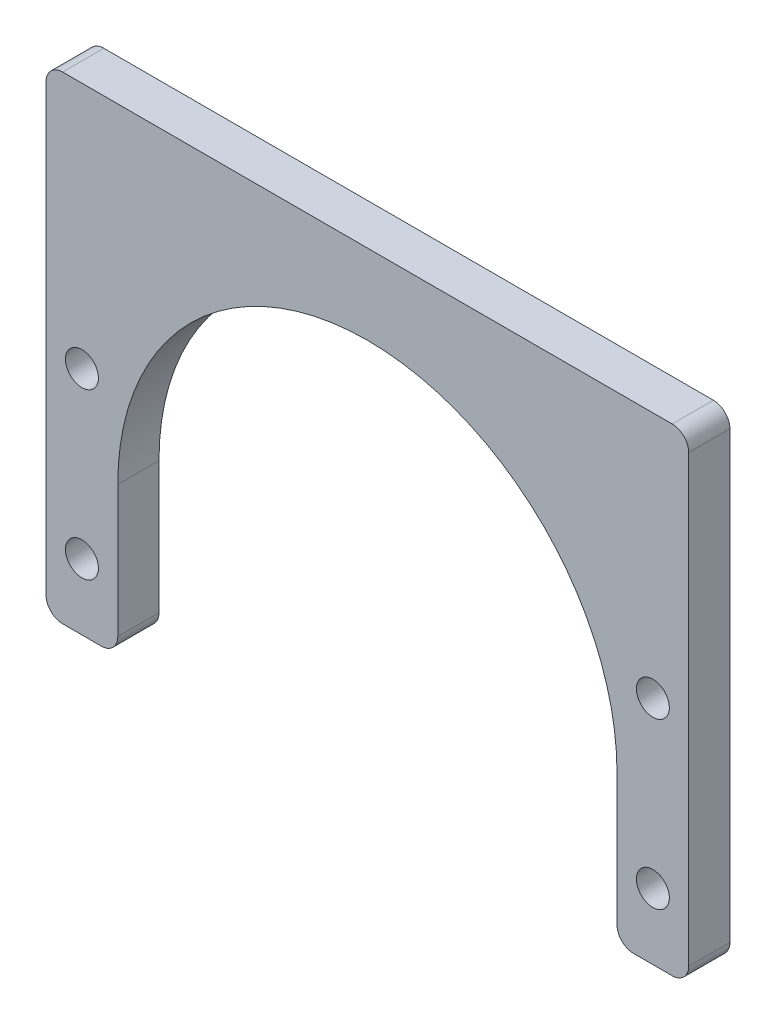
ISO-10303-21;
HEADER;
FILE_DESCRIPTION(('STEP AP214'),'2;1');
FILE_NAME('part.step','',(''),(''),'','','');
FILE_SCHEMA(('AUTOMOTIVE_DESIGN { 1 0 10303 214 1 1 1 1 }'));
ENDSEC;
DATA;
#1=APPLICATION_CONTEXT('core data for automotive mechanical design processes');
#2=APPLICATION_PROTOCOL_DEFINITION('international standard','automotive_design',2000,#1);
#3=PRODUCT_CONTEXT('',#1,'mechanical');
#4=PRODUCT('Part','Part','',(#3));
#5=PRODUCT_RELATED_PRODUCT_CATEGORY('part','',(#4));
#6=PRODUCT_DEFINITION_FORMATION('','',#4);
#7=PRODUCT_DEFINITION_CONTEXT('part definition',#1,'design');
#8=PRODUCT_DEFINITION('design','',#6,#7);
#9=PRODUCT_DEFINITION_SHAPE('','',#8);
#10=(LENGTH_UNIT() NAMED_UNIT(*) SI_UNIT(.MILLI.,.METRE.));
#11=(NAMED_UNIT(*) PLANE_ANGLE_UNIT() SI_UNIT($,.RADIAN.));
#12=(NAMED_UNIT(*) SI_UNIT($,.STERADIAN.) SOLID_ANGLE_UNIT());
#13=UNCERTAINTY_MEASURE_WITH_UNIT(LENGTH_MEASURE(1.E-05),#10,'distance_accuracy_value','');
#14=(GEOMETRIC_REPRESENTATION_CONTEXT(3) GLOBAL_UNCERTAINTY_ASSIGNED_CONTEXT((#13)) GLOBAL_UNIT_ASSIGNED_CONTEXT((#10,
#11,#12)) REPRESENTATION_CONTEXT('',''));
#15=CARTESIAN_POINT('',(0.,0.,0.));
#16=DIRECTION('',(0.,0.,1.));
#17=DIRECTION('',(1.,0.,0.));
#18=AXIS2_PLACEMENT_3D('',#15,#16,#17);
#19=CARTESIAN_POINT('',(0.,0.,5.));
#20=DIRECTION('',(0.,0.,-1.));
#21=DIRECTION('',(-1.,0.,0.));
#22=AXIS2_PLACEMENT_3D('',#19,#20,#21);
#23=CYLINDRICAL_SURFACE('',#22,30.3);
#24=CARTESIAN_POINT('',(0.,0.,0.));
#25=DIRECTION('',(0.,0.,1.));
#26=DIRECTION('',(1.,0.,0.));
#27=AXIS2_PLACEMENT_3D('',#24,#25,#26);
#28=CIRCLE('',#27,30.3);
#29=CARTESIAN_POINT('',(30.3,0.,0.));
#30=VERTEX_POINT('',#29);
#31=CARTESIAN_POINT('',(-30.3,0.,0.));
#32=VERTEX_POINT('',#31);
#33=EDGE_CURVE('E145',#30,#32,#28,.T.);
#34=ORIENTED_EDGE('',*,*,#33,.F.);
#35=DIRECTION('',(0.,0.,-1.));
#36=VECTOR('',#35,1.);
#37=CARTESIAN_POINT('',(30.3,0.,5.));
#38=LINE('',#37,#36);
#39=CARTESIAN_POINT('',(30.3,0.,5.));
#40=VERTEX_POINT('',#39);
#41=EDGE_CURVE('E139',#40,#30,#38,.T.);
#42=ORIENTED_EDGE('',*,*,#41,.F.);
#43=CARTESIAN_POINT('',(0.,0.,5.));
#44=DIRECTION('',(0.,0.,1.));
#45=DIRECTION('',(1.,0.,0.));
#46=AXIS2_PLACEMENT_3D('',#43,#44,#45);
#47=CIRCLE('',#46,30.3);
#48=CARTESIAN_POINT('',(-30.3,0.,5.));
#49=VERTEX_POINT('',#48);
#50=EDGE_CURVE('E142',#40,#49,#47,.T.);
#51=ORIENTED_EDGE('',*,*,#50,.T.);
#52=DIRECTION('',(0.,0.,-1.));
#53=VECTOR('',#52,1.);
#54=CARTESIAN_POINT('',(-30.3,0.,5.));
#55=LINE('',#54,#53);
#56=EDGE_CURVE('E150',#49,#32,#55,.T.);
#57=ORIENTED_EDGE('',*,*,#56,.T.);
#58=EDGE_LOOP('',(#34,#42,#51,#57));
#59=FACE_BOUND('',#58,.T.);
#60=ADVANCED_FACE('F36',(#59),#23,.F.);
#61=CARTESIAN_POINT('',(30.3,0.,5.));
#62=DIRECTION('',(1.,0.,0.));
#63=DIRECTION('',(0.,1.,0.));
#64=AXIS2_PLACEMENT_3D('',#61,#62,#63);
#65=PLANE('',#64);
#66=DIRECTION('',(0.,-1.,0.));
#67=VECTOR('',#66,1.);
#68=CARTESIAN_POINT('',(30.3,0.,0.));
#69=LINE('',#68,#67);
#70=CARTESIAN_POINT('',(30.3,-16.,0.));
#71=VERTEX_POINT('',#70);
#72=EDGE_CURVE('E198',#30,#71,#69,.T.);
#73=ORIENTED_EDGE('',*,*,#72,.T.);
#74=DIRECTION('',(0.,0.,-1.));
#75=VECTOR('',#74,1.);
#76=CARTESIAN_POINT('',(30.3,-16.,5.));
#77=LINE('',#76,#75);
#78=CARTESIAN_POINT('',(30.3,-16.,5.));
#79=VERTEX_POINT('',#78);
#80=EDGE_CURVE('E156',#71,#79,#77,.F.);
#81=ORIENTED_EDGE('',*,*,#80,.T.);
#82=DIRECTION('',(0.,-1.,0.));
#83=VECTOR('',#82,1.);
#84=CARTESIAN_POINT('',(30.3,0.,5.));
#85=LINE('',#84,#83);
#86=EDGE_CURVE('E153',#40,#79,#85,.T.);
#87=ORIENTED_EDGE('',*,*,#86,.F.);
#88=ORIENTED_EDGE('',*,*,#41,.T.);
#89=EDGE_LOOP('',(#73,#81,#87,#88));
#90=FACE_BOUND('',#89,.T.);
#91=ADVANCED_FACE('F154',(#90),#65,.F.);
#92=CARTESIAN_POINT('',(0.,-18.,5.));
#93=DIRECTION('',(0.,1.,0.));
#94=DIRECTION('',(-1.,0.,0.));
#95=AXIS2_PLACEMENT_3D('',#92,#93,#94);
#96=PLANE('',#95);
#97=DIRECTION('',(1.,0.,0.));
#98=VECTOR('',#97,1.);
#99=CARTESIAN_POINT('',(0.,-18.,5.));
#100=LINE('',#99,#98);
#101=CARTESIAN_POINT('',(32.3,-18.,5.));
#102=VERTEX_POINT('',#101);
#103=CARTESIAN_POINT('',(37.,-18.,5.));
#104=VERTEX_POINT('',#103);
#105=EDGE_CURVE('E158',#102,#104,#100,.T.);
#106=ORIENTED_EDGE('',*,*,#105,.F.);
#107=DIRECTION('',(0.,0.,-1.));
#108=VECTOR('',#107,1.);
#109=CARTESIAN_POINT('',(32.3,-18.,5.));
#110=LINE('',#109,#108);
#111=CARTESIAN_POINT('',(32.3,-18.,0.));
#112=VERTEX_POINT('',#111);
#113=EDGE_CURVE('E262',#102,#112,#110,.T.);
#114=ORIENTED_EDGE('',*,*,#113,.T.);
#115=DIRECTION('',(1.,0.,0.));
#116=VECTOR('',#115,1.);
#117=CARTESIAN_POINT('',(0.,-18.,0.));
#118=LINE('',#117,#116);
#119=CARTESIAN_POINT('',(37.,-18.,0.));
#120=VERTEX_POINT('',#119);
#121=EDGE_CURVE('E200',#112,#120,#118,.T.);
#122=ORIENTED_EDGE('',*,*,#121,.T.);
#123=DIRECTION('',(0.,0.,-1.));
#124=VECTOR('',#123,1.);
#125=CARTESIAN_POINT('',(37.,-18.,5.));
#126=LINE('',#125,#124);
#127=EDGE_CURVE('E260',#120,#104,#126,.F.);
#128=ORIENTED_EDGE('',*,*,#127,.T.);
#129=EDGE_LOOP('',(#106,#114,#122,#128));
#130=FACE_BOUND('',#129,.T.);
#131=ADVANCED_FACE('F306',(#130),#96,.F.);
#132=CARTESIAN_POINT('',(39.,0.,5.));
#133=DIRECTION('',(1.,0.,0.));
#134=DIRECTION('',(0.,1.,0.));
#135=AXIS2_PLACEMENT_3D('',#132,#133,#134);
#136=PLANE('',#135);
#137=DIRECTION('',(0.,-1.,0.));
#138=VECTOR('',#137,1.);
#139=CARTESIAN_POINT('',(39.,0.,5.));
#140=LINE('',#139,#138);
#141=CARTESIAN_POINT('',(39.,38.,5.));
#142=VERTEX_POINT('',#141);
#143=CARTESIAN_POINT('',(39.,-16.,5.));
#144=VERTEX_POINT('',#143);
#145=EDGE_CURVE('E173',#142,#144,#140,.T.);
#146=ORIENTED_EDGE('',*,*,#145,.T.);
#147=DIRECTION('',(0.,0.,-1.));
#148=VECTOR('',#147,1.);
#149=CARTESIAN_POINT('',(39.,-16.,0.));
#150=LINE('',#149,#148);
#151=CARTESIAN_POINT('',(39.,-16.,0.));
#152=VERTEX_POINT('',#151);
#153=EDGE_CURVE('E268',#144,#152,#150,.T.);
#154=ORIENTED_EDGE('',*,*,#153,.T.);
#155=DIRECTION('',(0.,-1.,0.));
#156=VECTOR('',#155,1.);
#157=CARTESIAN_POINT('',(39.,0.,0.));
#158=LINE('',#157,#156);
#159=CARTESIAN_POINT('',(39.,38.,0.));
#160=VERTEX_POINT('',#159);
#161=EDGE_CURVE('E203',#160,#152,#158,.T.);
#162=ORIENTED_EDGE('',*,*,#161,.F.);
#163=DIRECTION('',(0.,0.,-1.));
#164=VECTOR('',#163,1.);
#165=CARTESIAN_POINT('',(39.,38.,5.));
#166=LINE('',#165,#164);
#167=EDGE_CURVE('E266',#160,#142,#166,.F.);
#168=ORIENTED_EDGE('',*,*,#167,.T.);
#169=EDGE_LOOP('',(#146,#154,#162,#168));
#170=FACE_BOUND('',#169,.T.);
#171=ADVANCED_FACE('F312',(#170),#136,.T.);
#172=CARTESIAN_POINT('',(0.,40.,5.));
#173=DIRECTION('',(0.,1.,0.));
#174=DIRECTION('',(-1.,0.,0.));
#175=AXIS2_PLACEMENT_3D('',#172,#173,#174);
#176=PLANE('',#175);
#177=DIRECTION('',(1.,0.,0.));
#178=VECTOR('',#177,1.);
#179=CARTESIAN_POINT('',(0.,40.,5.));
#180=LINE('',#179,#178);
#181=CARTESIAN_POINT('',(-37.,40.,5.));
#182=VERTEX_POINT('',#181);
#183=CARTESIAN_POINT('',(37.,40.,5.));
#184=VERTEX_POINT('',#183);
#185=EDGE_CURVE('E176',#182,#184,#180,.T.);
#186=ORIENTED_EDGE('',*,*,#185,.T.);
#187=DIRECTION('',(0.,0.,-1.));
#188=VECTOR('',#187,1.);
#189=CARTESIAN_POINT('',(37.,40.,5.));
#190=LINE('',#189,#188);
#191=CARTESIAN_POINT('',(37.,40.,0.));
#192=VERTEX_POINT('',#191);
#193=EDGE_CURVE('E11',#184,#192,#190,.T.);
#194=ORIENTED_EDGE('',*,*,#193,.T.);
#195=DIRECTION('',(1.,0.,0.));
#196=VECTOR('',#195,1.);
#197=CARTESIAN_POINT('',(0.,40.,0.));
#198=LINE('',#197,#196);
#199=CARTESIAN_POINT('',(-37.,40.,0.));
#200=VERTEX_POINT('',#199);
#201=EDGE_CURVE('E206',#200,#192,#198,.T.);
#202=ORIENTED_EDGE('',*,*,#201,.F.);
#203=DIRECTION('',(0.,0.,-1.));
#204=VECTOR('',#203,1.);
#205=CARTESIAN_POINT('',(-37.,40.,5.));
#206=LINE('',#205,#204);
#207=EDGE_CURVE('E44',#200,#182,#206,.F.);
#208=ORIENTED_EDGE('',*,*,#207,.T.);
#209=EDGE_LOOP('',(#186,#194,#202,#208));
#210=FACE_BOUND('',#209,.T.);
#211=ADVANCED_FACE('F273',(#210),#176,.T.);
#212=CARTESIAN_POINT('',(-39.,0.,5.));
#213=DIRECTION('',(1.,0.,0.));
#214=DIRECTION('',(0.,1.,0.));
#215=AXIS2_PLACEMENT_3D('',#212,#213,#214);
#216=PLANE('',#215);
#217=DIRECTION('',(0.,-1.,0.));
#218=VECTOR('',#217,1.);
#219=CARTESIAN_POINT('',(-39.,0.,0.));
#220=LINE('',#219,#218);
#221=CARTESIAN_POINT('',(-39.,38.,0.));
#222=VERTEX_POINT('',#221);
#223=CARTESIAN_POINT('',(-39.,-16.,0.));
#224=VERTEX_POINT('',#223);
#225=EDGE_CURVE('E209',#222,#224,#220,.T.);
#226=ORIENTED_EDGE('',*,*,#225,.T.);
#227=DIRECTION('',(0.,0.,-1.));
#228=VECTOR('',#227,1.);
#229=CARTESIAN_POINT('',(-39.,-16.,5.));
#230=LINE('',#229,#228);
#231=CARTESIAN_POINT('',(-39.,-16.,5.));
#232=VERTEX_POINT('',#231);
#233=EDGE_CURVE('E51',#224,#232,#230,.F.);
#234=ORIENTED_EDGE('',*,*,#233,.T.);
#235=DIRECTION('',(0.,-1.,0.));
#236=VECTOR('',#235,1.);
#237=CARTESIAN_POINT('',(-39.,0.,5.));
#238=LINE('',#237,#236);
#239=CARTESIAN_POINT('',(-39.,38.,5.));
#240=VERTEX_POINT('',#239);
#241=EDGE_CURVE('E179',#240,#232,#238,.T.);
#242=ORIENTED_EDGE('',*,*,#241,.F.);
#243=DIRECTION('',(0.,0.,-1.));
#244=VECTOR('',#243,1.);
#245=CARTESIAN_POINT('',(-39.,38.,0.));
#246=LINE('',#245,#244);
#247=EDGE_CURVE('E256',#240,#222,#246,.T.);
#248=ORIENTED_EDGE('',*,*,#247,.T.);
#249=EDGE_LOOP('',(#226,#234,#242,#248));
#250=FACE_BOUND('',#249,.T.);
#251=ADVANCED_FACE('F280',(#250),#216,.F.);
#252=CARTESIAN_POINT('',(0.,-18.,5.));
#253=DIRECTION('',(0.,-1.,0.));
#254=DIRECTION('',(0.,0.,-1.));
#255=AXIS2_PLACEMENT_3D('',#252,#253,#254);
#256=PLANE('',#255);
#257=DIRECTION('',(-1.,0.,0.));
#258=VECTOR('',#257,1.);
#259=CARTESIAN_POINT('',(0.,-18.,0.));
#260=LINE('',#259,#258);
#261=CARTESIAN_POINT('',(-32.3,-18.,0.));
#262=VERTEX_POINT('',#261);
#263=CARTESIAN_POINT('',(-37.,-18.,0.));
#264=VERTEX_POINT('',#263);
#265=EDGE_CURVE('E211',#262,#264,#260,.T.);
#266=ORIENTED_EDGE('',*,*,#265,.F.);
#267=DIRECTION('',(0.,0.,-1.));
#268=VECTOR('',#267,1.);
#269=CARTESIAN_POINT('',(-32.3,-18.,5.));
#270=LINE('',#269,#268);
#271=CARTESIAN_POINT('',(-32.3,-18.,5.));
#272=VERTEX_POINT('',#271);
#273=EDGE_CURVE('E243',#262,#272,#270,.F.);
#274=ORIENTED_EDGE('',*,*,#273,.T.);
#275=DIRECTION('',(-1.,0.,0.));
#276=VECTOR('',#275,1.);
#277=CARTESIAN_POINT('',(0.,-18.,5.));
#278=LINE('',#277,#276);
#279=CARTESIAN_POINT('',(-37.,-18.,5.));
#280=VERTEX_POINT('',#279);
#281=EDGE_CURVE('E181',#272,#280,#278,.T.);
#282=ORIENTED_EDGE('',*,*,#281,.T.);
#283=DIRECTION('',(0.,0.,-1.));
#284=VECTOR('',#283,1.);
#285=CARTESIAN_POINT('',(-37.,-18.,0.));
#286=LINE('',#285,#284);
#287=EDGE_CURVE('E240',#280,#264,#286,.T.);
#288=ORIENTED_EDGE('',*,*,#287,.T.);
#289=EDGE_LOOP('',(#266,#274,#282,#288));
#290=FACE_BOUND('',#289,.T.);
#291=ADVANCED_FACE('F290',(#290),#256,.T.);
#292=CARTESIAN_POINT('',(-34.65,-10.,5.));
#293=DIRECTION('',(0.,0.,-1.));
#294=DIRECTION('',(-1.,0.,0.));
#295=AXIS2_PLACEMENT_3D('',#292,#293,#294);
#296=CYLINDRICAL_SURFACE('',#295,2.);
#297=CARTESIAN_POINT('',(-34.65,-10.,5.));
#298=DIRECTION('',(0.,0.,1.));
#299=DIRECTION('',(1.,0.,0.));
#300=AXIS2_PLACEMENT_3D('',#297,#298,#299);
#301=CIRCLE('',#300,2.);
#302=CARTESIAN_POINT('',(-32.65,-10.,5.));
#303=VERTEX_POINT('',#302);
#304=EDGE_CURVE('E191',#303,#303,#301,.F.);
#305=ORIENTED_EDGE('',*,*,#304,.F.);
#306=EDGE_LOOP('',(#305));
#307=FACE_BOUND('',#306,.T.);
#308=CARTESIAN_POINT('',(-34.65,-10.,0.));
#309=DIRECTION('',(0.,0.,1.));
#310=DIRECTION('',(1.,0.,0.));
#311=AXIS2_PLACEMENT_3D('',#308,#309,#310);
#312=CIRCLE('',#311,2.);
#313=CARTESIAN_POINT('',(-32.65,-10.,0.));
#314=VERTEX_POINT('',#313);
#315=EDGE_CURVE('E168',#314,#314,#312,.F.);
#316=ORIENTED_EDGE('',*,*,#315,.T.);
#317=EDGE_LOOP('',(#316));
#318=FACE_BOUND('',#317,.T.);
#319=ADVANCED_FACE('F409',(#307,#318),#296,.F.);
#320=CARTESIAN_POINT('',(34.65,10.,5.));
#321=DIRECTION('',(0.,0.,-1.));
#322=DIRECTION('',(-1.,0.,0.));
#323=AXIS2_PLACEMENT_3D('',#320,#321,#322);
#324=CYLINDRICAL_SURFACE('',#323,2.);
#325=CARTESIAN_POINT('',(34.65,10.,5.));
#326=DIRECTION('',(0.,0.,1.));
#327=DIRECTION('',(1.,0.,0.));
#328=AXIS2_PLACEMENT_3D('',#325,#326,#327);
#329=CIRCLE('',#328,2.);
#330=CARTESIAN_POINT('',(36.65,10.,5.));
#331=VERTEX_POINT('',#330);
#332=EDGE_CURVE('E188',#331,#331,#329,.F.);
#333=ORIENTED_EDGE('',*,*,#332,.F.);
#334=EDGE_LOOP('',(#333));
#335=FACE_BOUND('',#334,.T.);
#336=CARTESIAN_POINT('',(34.65,10.,0.));
#337=DIRECTION('',(0.,0.,1.));
#338=DIRECTION('',(1.,0.,0.));
#339=AXIS2_PLACEMENT_3D('',#336,#337,#338);
#340=CIRCLE('',#339,2.);
#341=CARTESIAN_POINT('',(36.65,10.,0.));
#342=VERTEX_POINT('',#341);
#343=EDGE_CURVE('E220',#342,#342,#340,.F.);
#344=ORIENTED_EDGE('',*,*,#343,.T.);
#345=EDGE_LOOP('',(#344));
#346=FACE_BOUND('',#345,.T.);
#347=ADVANCED_FACE('F464',(#335,#346),#324,.F.);
#348=CARTESIAN_POINT('',(-34.65,10.,5.));
#349=DIRECTION('',(0.,0.,-1.));
#350=DIRECTION('',(-1.,0.,0.));
#351=AXIS2_PLACEMENT_3D('',#348,#349,#350);
#352=CYLINDRICAL_SURFACE('',#351,2.);
#353=CARTESIAN_POINT('',(-34.65,10.,5.));
#354=DIRECTION('',(0.,0.,1.));
#355=DIRECTION('',(1.,0.,0.));
#356=AXIS2_PLACEMENT_3D('',#353,#354,#355);
#357=CIRCLE('',#356,2.);
#358=CARTESIAN_POINT('',(-32.65,10.,5.));
#359=VERTEX_POINT('',#358);
#360=EDGE_CURVE('E185',#359,#359,#357,.T.);
#361=ORIENTED_EDGE('',*,*,#360,.T.);
#362=EDGE_LOOP('',(#361));
#363=FACE_BOUND('',#362,.T.);
#364=CARTESIAN_POINT('',(-34.65,10.,0.));
#365=DIRECTION('',(0.,0.,1.));
#366=DIRECTION('',(1.,0.,0.));
#367=AXIS2_PLACEMENT_3D('',#364,#365,#366);
#368=CIRCLE('',#367,2.);
#369=CARTESIAN_POINT('',(-32.65,10.,0.));
#370=VERTEX_POINT('',#369);
#371=EDGE_CURVE('E217',#370,#370,#368,.T.);
#372=ORIENTED_EDGE('',*,*,#371,.F.);
#373=EDGE_LOOP('',(#372));
#374=FACE_BOUND('',#373,.T.);
#375=ADVANCED_FACE('F397',(#363,#374),#352,.F.);
#376=CARTESIAN_POINT('',(-30.3,0.,5.));
#377=DIRECTION('',(1.,0.,0.));
#378=DIRECTION('',(0.,1.,0.));
#379=AXIS2_PLACEMENT_3D('',#376,#377,#378);
#380=PLANE('',#379);
#381=DIRECTION('',(0.,-1.,0.));
#382=VECTOR('',#381,1.);
#383=CARTESIAN_POINT('',(-30.3,0.,5.));
#384=LINE('',#383,#382);
#385=CARTESIAN_POINT('',(-30.3,-16.,5.));
#386=VERTEX_POINT('',#385);
#387=EDGE_CURVE('E164',#49,#386,#384,.T.);
#388=ORIENTED_EDGE('',*,*,#387,.T.);
#389=DIRECTION('',(0.,0.,-1.));
#390=VECTOR('',#389,1.);
#391=CARTESIAN_POINT('',(-30.3,-16.,5.));
#392=LINE('',#391,#390);
#393=CARTESIAN_POINT('',(-30.3,-16.,0.));
#394=VERTEX_POINT('',#393);
#395=EDGE_CURVE('E149',#386,#394,#392,.T.);
#396=ORIENTED_EDGE('',*,*,#395,.T.);
#397=DIRECTION('',(0.,-1.,0.));
#398=VECTOR('',#397,1.);
#399=CARTESIAN_POINT('',(-30.3,0.,0.));
#400=LINE('',#399,#398);
#401=EDGE_CURVE('E214',#32,#394,#400,.T.);
#402=ORIENTED_EDGE('',*,*,#401,.F.);
#403=ORIENTED_EDGE('',*,*,#56,.F.);
#404=EDGE_LOOP('',(#388,#396,#402,#403));
#405=FACE_BOUND('',#404,.T.);
#406=ADVANCED_FACE('F298',(#405),#380,.T.);
#407=CARTESIAN_POINT('',(34.65,-9.99999999999994,5.));
#408=DIRECTION('',(0.,0.,-1.));
#409=DIRECTION('',(-1.,0.,0.));
#410=AXIS2_PLACEMENT_3D('',#407,#408,#409);
#411=CYLINDRICAL_SURFACE('',#410,2.);
#412=CARTESIAN_POINT('',(34.65,-9.99999999999994,5.));
#413=DIRECTION('',(0.,0.,1.));
#414=DIRECTION('',(1.,0.,0.));
#415=AXIS2_PLACEMENT_3D('',#412,#413,#414);
#416=CIRCLE('',#415,2.);
#417=CARTESIAN_POINT('',(36.65,-9.99999999999994,5.));
#418=VERTEX_POINT('',#417);
#419=EDGE_CURVE('E194',#418,#418,#416,.T.);
#420=ORIENTED_EDGE('',*,*,#419,.T.);
#421=EDGE_LOOP('',(#420));
#422=FACE_BOUND('',#421,.T.);
#423=CARTESIAN_POINT('',(34.65,-9.99999999999994,0.));
#424=DIRECTION('',(0.,0.,1.));
#425=DIRECTION('',(1.,0.,0.));
#426=AXIS2_PLACEMENT_3D('',#423,#424,#425);
#427=CIRCLE('',#426,2.);
#428=CARTESIAN_POINT('',(36.65,-9.99999999999994,0.));
#429=VERTEX_POINT('',#428);
#430=EDGE_CURVE('E165',#429,#429,#427,.T.);
#431=ORIENTED_EDGE('',*,*,#430,.F.);
#432=EDGE_LOOP('',(#431));
#433=FACE_BOUND('',#432,.T.);
#434=ADVANCED_FACE('F386',(#422,#433),#411,.F.);
#435=CARTESIAN_POINT('',(0.,0.,5.));
#436=DIRECTION('',(0.,0.,1.));
#437=DIRECTION('',(1.,0.,0.));
#438=AXIS2_PLACEMENT_3D('',#435,#436,#437);
#439=PLANE('',#438);
#440=ORIENTED_EDGE('',*,*,#281,.F.);
#441=CARTESIAN_POINT('',(-32.3,-16.,5.));
#442=DIRECTION('',(0.,0.,1.));
#443=DIRECTION('',(1.,0.,0.));
#444=AXIS2_PLACEMENT_3D('',#441,#442,#443);
#445=CIRCLE('',#444,2.);
#446=EDGE_CURVE('E254',#272,#386,#445,.T.);
#447=ORIENTED_EDGE('',*,*,#446,.T.);
#448=ORIENTED_EDGE('',*,*,#387,.F.);
#449=ORIENTED_EDGE('',*,*,#50,.F.);
#450=ORIENTED_EDGE('',*,*,#86,.T.);
#451=CARTESIAN_POINT('',(32.3,-16.,5.));
#452=DIRECTION('',(0.,0.,1.));
#453=DIRECTION('',(1.,0.,0.));
#454=AXIS2_PLACEMENT_3D('',#451,#452,#453);
#455=CIRCLE('',#454,2.);
#456=EDGE_CURVE('E250',#79,#102,#455,.T.);
#457=ORIENTED_EDGE('',*,*,#456,.T.);
#458=ORIENTED_EDGE('',*,*,#105,.T.);
#459=CARTESIAN_POINT('',(37.,-16.,5.));
#460=DIRECTION('',(0.,0.,1.));
#461=DIRECTION('',(1.,0.,0.));
#462=AXIS2_PLACEMENT_3D('',#459,#460,#461);
#463=CIRCLE('',#462,2.);
#464=EDGE_CURVE('E248',#104,#144,#463,.T.);
#465=ORIENTED_EDGE('',*,*,#464,.T.);
#466=ORIENTED_EDGE('',*,*,#145,.F.);
#467=CARTESIAN_POINT('',(37.,38.,5.));
#468=DIRECTION('',(0.,0.,1.));
#469=DIRECTION('',(1.,0.,0.));
#470=AXIS2_PLACEMENT_3D('',#467,#468,#469);
#471=CIRCLE('',#470,2.);
#472=EDGE_CURVE('E246',#142,#184,#471,.T.);
#473=ORIENTED_EDGE('',*,*,#472,.T.);
#474=ORIENTED_EDGE('',*,*,#185,.F.);
#475=CARTESIAN_POINT('',(-37.,38.,5.));
#476=DIRECTION('',(0.,0.,1.));
#477=DIRECTION('',(1.,0.,0.));
#478=AXIS2_PLACEMENT_3D('',#475,#476,#477);
#479=CIRCLE('',#478,2.);
#480=EDGE_CURVE('E58',#182,#240,#479,.T.);
#481=ORIENTED_EDGE('',*,*,#480,.T.);
#482=ORIENTED_EDGE('',*,*,#241,.T.);
#483=CARTESIAN_POINT('',(-37.,-16.,5.));
#484=DIRECTION('',(0.,0.,1.));
#485=DIRECTION('',(1.,0.,0.));
#486=AXIS2_PLACEMENT_3D('',#483,#484,#485);
#487=CIRCLE('',#486,2.);
#488=EDGE_CURVE('E252',#232,#280,#487,.T.);
#489=ORIENTED_EDGE('',*,*,#488,.T.);
#490=EDGE_LOOP('',(#440,#447,#448,#449,#450,#457,#458,#465,#466,#473,#474,#481,#482,#489));
#491=FACE_BOUND('',#490,.T.);
#492=ORIENTED_EDGE('',*,*,#360,.F.);
#493=EDGE_LOOP('',(#492));
#494=FACE_BOUND('',#493,.T.);
#495=ORIENTED_EDGE('',*,*,#332,.T.);
#496=EDGE_LOOP('',(#495));
#497=FACE_BOUND('',#496,.T.);
#498=ORIENTED_EDGE('',*,*,#304,.T.);
#499=EDGE_LOOP('',(#498));
#500=FACE_BOUND('',#499,.T.);
#501=ORIENTED_EDGE('',*,*,#419,.F.);
#502=EDGE_LOOP('',(#501));
#503=FACE_BOUND('',#502,.T.);
#504=ADVANCED_FACE('F161',(#491,#494,#497,#500,#503),#439,.T.);
#505=CARTESIAN_POINT('',(0.,0.,0.));
#506=DIRECTION('',(0.,0.,1.));
#507=DIRECTION('',(1.,0.,0.));
#508=AXIS2_PLACEMENT_3D('',#505,#506,#507);
#509=PLANE('',#508);
#510=ORIENTED_EDGE('',*,*,#401,.T.);
#511=CARTESIAN_POINT('',(-32.3,-16.,0.));
#512=DIRECTION('',(0.,0.,1.));
#513=DIRECTION('',(1.,0.,0.));
#514=AXIS2_PLACEMENT_3D('',#511,#512,#513);
#515=CIRCLE('',#514,2.);
#516=EDGE_CURVE('E238',#394,#262,#515,.F.);
#517=ORIENTED_EDGE('',*,*,#516,.T.);
#518=ORIENTED_EDGE('',*,*,#265,.T.);
#519=CARTESIAN_POINT('',(-37.,-16.,0.));
#520=DIRECTION('',(0.,0.,1.));
#521=DIRECTION('',(1.,0.,0.));
#522=AXIS2_PLACEMENT_3D('',#519,#520,#521);
#523=CIRCLE('',#522,2.);
#524=EDGE_CURVE('E236',#264,#224,#523,.F.);
#525=ORIENTED_EDGE('',*,*,#524,.T.);
#526=ORIENTED_EDGE('',*,*,#225,.F.);
#527=CARTESIAN_POINT('',(-37.,38.,0.));
#528=DIRECTION('',(0.,0.,1.));
#529=DIRECTION('',(1.,0.,0.));
#530=AXIS2_PLACEMENT_3D('',#527,#528,#529);
#531=CIRCLE('',#530,2.);
#532=EDGE_CURVE('E228',#222,#200,#531,.F.);
#533=ORIENTED_EDGE('',*,*,#532,.T.);
#534=ORIENTED_EDGE('',*,*,#201,.T.);
#535=CARTESIAN_POINT('',(37.,38.,0.));
#536=DIRECTION('',(0.,0.,1.));
#537=DIRECTION('',(1.,0.,0.));
#538=AXIS2_PLACEMENT_3D('',#535,#536,#537);
#539=CIRCLE('',#538,2.);
#540=EDGE_CURVE('E230',#192,#160,#539,.F.);
#541=ORIENTED_EDGE('',*,*,#540,.T.);
#542=ORIENTED_EDGE('',*,*,#161,.T.);
#543=CARTESIAN_POINT('',(37.,-16.,0.));
#544=DIRECTION('',(0.,0.,1.));
#545=DIRECTION('',(1.,0.,0.));
#546=AXIS2_PLACEMENT_3D('',#543,#544,#545);
#547=CIRCLE('',#546,2.);
#548=EDGE_CURVE('E232',#152,#120,#547,.F.);
#549=ORIENTED_EDGE('',*,*,#548,.T.);
#550=ORIENTED_EDGE('',*,*,#121,.F.);
#551=CARTESIAN_POINT('',(32.3,-16.,0.));
#552=DIRECTION('',(0.,0.,1.));
#553=DIRECTION('',(1.,0.,0.));
#554=AXIS2_PLACEMENT_3D('',#551,#552,#553);
#555=CIRCLE('',#554,2.);
#556=EDGE_CURVE('E234',#112,#71,#555,.F.);
#557=ORIENTED_EDGE('',*,*,#556,.T.);
#558=ORIENTED_EDGE('',*,*,#72,.F.);
#559=ORIENTED_EDGE('',*,*,#33,.T.);
#560=EDGE_LOOP('',(#510,#517,#518,#525,#526,#533,#534,#541,#542,#549,#550,#557,#558,#559));
#561=FACE_BOUND('',#560,.T.);
#562=ORIENTED_EDGE('',*,*,#371,.T.);
#563=EDGE_LOOP('',(#562));
#564=FACE_BOUND('',#563,.T.);
#565=ORIENTED_EDGE('',*,*,#343,.F.);
#566=EDGE_LOOP('',(#565));
#567=FACE_BOUND('',#566,.T.);
#568=ORIENTED_EDGE('',*,*,#315,.F.);
#569=EDGE_LOOP('',(#568));
#570=FACE_BOUND('',#569,.T.);
#571=ORIENTED_EDGE('',*,*,#430,.T.);
#572=EDGE_LOOP('',(#571));
#573=FACE_BOUND('',#572,.T.);
#574=ADVANCED_FACE('F282',(#561,#564,#567,#570,#573),#509,.F.);
#575=CARTESIAN_POINT('',(-32.3,-16.,5.));
#576=DIRECTION('',(0.,0.,-1.));
#577=DIRECTION('',(-1.,0.,0.));
#578=AXIS2_PLACEMENT_3D('',#575,#576,#577);
#579=CYLINDRICAL_SURFACE('',#578,2.);
#580=ORIENTED_EDGE('',*,*,#446,.F.);
#581=ORIENTED_EDGE('',*,*,#273,.F.);
#582=ORIENTED_EDGE('',*,*,#516,.F.);
#583=ORIENTED_EDGE('',*,*,#395,.F.);
#584=EDGE_LOOP('',(#580,#581,#582,#583));
#585=FACE_BOUND('',#584,.T.);
#586=ADVANCED_FACE('F295',(#585),#579,.T.);
#587=CARTESIAN_POINT('',(-37.,-16.,5.));
#588=DIRECTION('',(0.,0.,1.));
#589=DIRECTION('',(1.,0.,0.));
#590=AXIS2_PLACEMENT_3D('',#587,#588,#589);
#591=CYLINDRICAL_SURFACE('',#590,2.);
#592=ORIENTED_EDGE('',*,*,#488,.F.);
#593=ORIENTED_EDGE('',*,*,#233,.F.);
#594=ORIENTED_EDGE('',*,*,#524,.F.);
#595=ORIENTED_EDGE('',*,*,#287,.F.);
#596=EDGE_LOOP('',(#592,#593,#594,#595));
#597=FACE_BOUND('',#596,.T.);
#598=ADVANCED_FACE('F288',(#597),#591,.T.);
#599=CARTESIAN_POINT('',(32.3,-16.,5.));
#600=DIRECTION('',(0.,0.,-1.));
#601=DIRECTION('',(-1.,0.,0.));
#602=AXIS2_PLACEMENT_3D('',#599,#600,#601);
#603=CYLINDRICAL_SURFACE('',#602,2.);
#604=ORIENTED_EDGE('',*,*,#456,.F.);
#605=ORIENTED_EDGE('',*,*,#80,.F.);
#606=ORIENTED_EDGE('',*,*,#556,.F.);
#607=ORIENTED_EDGE('',*,*,#113,.F.);
#608=EDGE_LOOP('',(#604,#605,#606,#607));
#609=FACE_BOUND('',#608,.T.);
#610=ADVANCED_FACE('F301',(#609),#603,.T.);
#611=CARTESIAN_POINT('',(37.,-16.,5.));
#612=DIRECTION('',(0.,0.,1.));
#613=DIRECTION('',(1.,0.,0.));
#614=AXIS2_PLACEMENT_3D('',#611,#612,#613);
#615=CYLINDRICAL_SURFACE('',#614,2.);
#616=ORIENTED_EDGE('',*,*,#464,.F.);
#617=ORIENTED_EDGE('',*,*,#127,.F.);
#618=ORIENTED_EDGE('',*,*,#548,.F.);
#619=ORIENTED_EDGE('',*,*,#153,.F.);
#620=EDGE_LOOP('',(#616,#617,#618,#619));
#621=FACE_BOUND('',#620,.T.);
#622=ADVANCED_FACE('F309',(#621),#615,.T.);
#623=CARTESIAN_POINT('',(37.,38.,5.));
#624=DIRECTION('',(0.,0.,-1.));
#625=DIRECTION('',(-1.,0.,0.));
#626=AXIS2_PLACEMENT_3D('',#623,#624,#625);
#627=CYLINDRICAL_SURFACE('',#626,2.);
#628=ORIENTED_EDGE('',*,*,#472,.F.);
#629=ORIENTED_EDGE('',*,*,#167,.F.);
#630=ORIENTED_EDGE('',*,*,#540,.F.);
#631=ORIENTED_EDGE('',*,*,#193,.F.);
#632=EDGE_LOOP('',(#628,#629,#630,#631));
#633=FACE_BOUND('',#632,.T.);
#634=ADVANCED_FACE('F316',(#633),#627,.T.);
#635=CARTESIAN_POINT('',(-37.,38.,5.));
#636=DIRECTION('',(0.,0.,1.));
#637=DIRECTION('',(1.,0.,0.));
#638=AXIS2_PLACEMENT_3D('',#635,#636,#637);
#639=CYLINDRICAL_SURFACE('',#638,2.);
#640=ORIENTED_EDGE('',*,*,#480,.F.);
#641=ORIENTED_EDGE('',*,*,#207,.F.);
#642=ORIENTED_EDGE('',*,*,#532,.F.);
#643=ORIENTED_EDGE('',*,*,#247,.F.);
#644=EDGE_LOOP('',(#640,#641,#642,#643));
#645=FACE_BOUND('',#644,.T.);
#646=ADVANCED_FACE('F38',(#645),#639,.T.);
#647=CLOSED_SHELL('',(#60,#91,#131,#171,#211,#251,#291,#319,#347,#375,#406,#434,#504,#574,#586,
#598,#610,#622,#634,#646));
#648=MANIFOLD_SOLID_BREP('B2',#647);
#649=ADVANCED_BREP_SHAPE_REPRESENTATION('',(#18,#648),#14);
#650=SHAPE_DEFINITION_REPRESENTATION(#9,#649);
ENDSEC;
END-ISO-10303-21;
